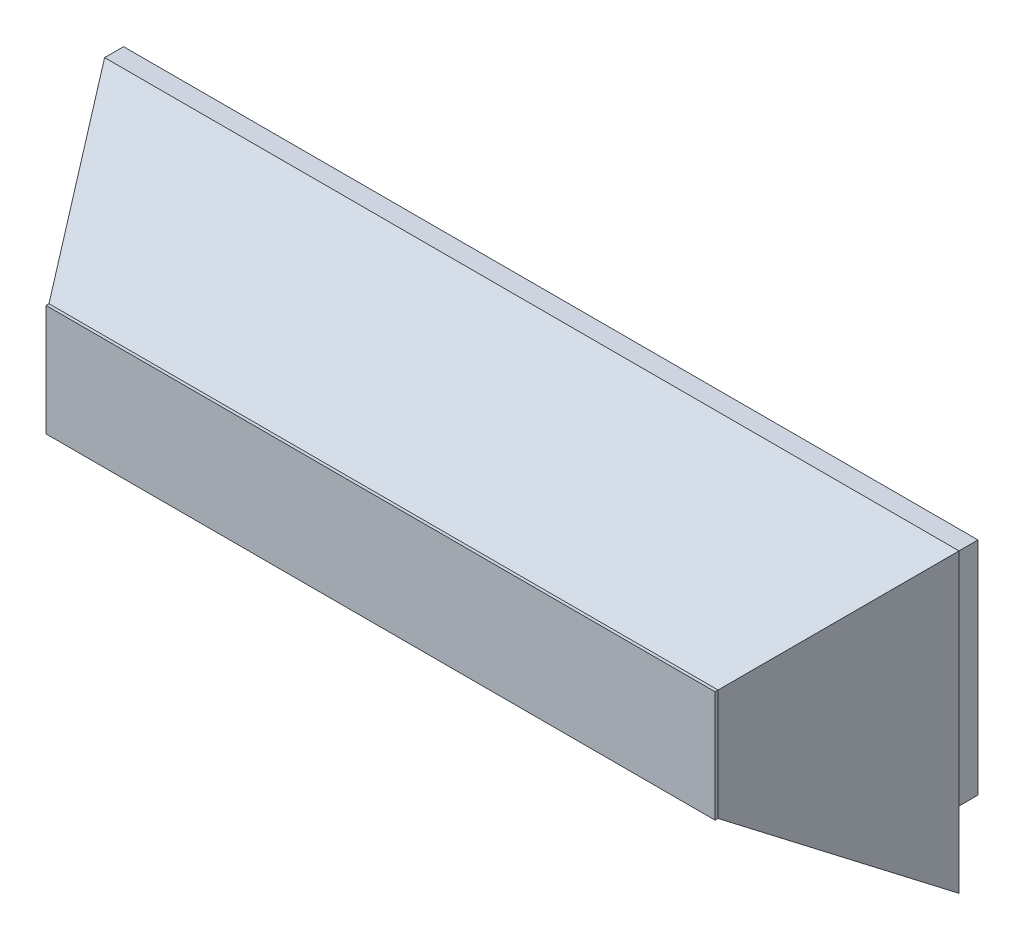
ISO-10303-21;
HEADER;
FILE_DESCRIPTION(('STEP AP214'),'2;1');
FILE_NAME('part.step','',(''),(''),'','','');
FILE_SCHEMA(('AUTOMOTIVE_DESIGN { 1 0 10303 214 1 1 1 1 }'));
ENDSEC;
DATA;
#1=APPLICATION_CONTEXT('core data for automotive mechanical design processes');
#2=APPLICATION_PROTOCOL_DEFINITION('international standard','automotive_design',2000,#1);
#3=PRODUCT_CONTEXT('',#1,'mechanical');
#4=PRODUCT('Part','Part','',(#3));
#5=PRODUCT_RELATED_PRODUCT_CATEGORY('part','',(#4));
#6=PRODUCT_DEFINITION_FORMATION('','',#4);
#7=PRODUCT_DEFINITION_CONTEXT('part definition',#1,'design');
#8=PRODUCT_DEFINITION('design','',#6,#7);
#9=PRODUCT_DEFINITION_SHAPE('','',#8);
#10=(LENGTH_UNIT() NAMED_UNIT(*) SI_UNIT(.MILLI.,.METRE.));
#11=(NAMED_UNIT(*) PLANE_ANGLE_UNIT() SI_UNIT($,.RADIAN.));
#12=(NAMED_UNIT(*) SI_UNIT($,.STERADIAN.) SOLID_ANGLE_UNIT());
#13=UNCERTAINTY_MEASURE_WITH_UNIT(LENGTH_MEASURE(1.E-05),#10,'distance_accuracy_value','');
#14=(GEOMETRIC_REPRESENTATION_CONTEXT(3) GLOBAL_UNCERTAINTY_ASSIGNED_CONTEXT((#13)) GLOBAL_UNIT_ASSIGNED_CONTEXT((#10,
#11,#12)) REPRESENTATION_CONTEXT('',''));
#15=CARTESIAN_POINT('',(0.,0.,0.));
#16=DIRECTION('',(0.,0.,1.));
#17=DIRECTION('',(1.,0.,0.));
#18=AXIS2_PLACEMENT_3D('',#15,#16,#17);
#19=CARTESIAN_POINT('',(135.343835461756,-26.3747756914821,51.));
#20=DIRECTION('',(0.,1.,0.));
#21=DIRECTION('',(0.,0.,1.));
#22=AXIS2_PLACEMENT_3D('',#19,#20,#21);
#23=PLANE('',#22);
#24=DIRECTION('',(1.,0.,0.));
#25=VECTOR('',#24,1.);
#26=CARTESIAN_POINT('',(135.343835461756,-26.3747756914821,50.));
#27=LINE('',#26,#25);
#28=CARTESIAN_POINT('',(-90.2692293473108,-26.3747756914821,50.));
#29=VERTEX_POINT('',#28);
#30=CARTESIAN_POINT('',(135.343835461756,-26.3747756914821,50.));
#31=VERTEX_POINT('',#30);
#32=EDGE_CURVE('E110',#29,#31,#27,.T.);
#33=ORIENTED_EDGE('',*,*,#32,.T.);
#34=DIRECTION('',(0.,0.,-1.));
#35=VECTOR('',#34,1.);
#36=CARTESIAN_POINT('',(135.343835461756,-26.3747756914821,51.));
#37=LINE('',#36,#35);
#38=CARTESIAN_POINT('',(135.343835461756,-26.3747756914821,51.));
#39=VERTEX_POINT('',#38);
#40=EDGE_CURVE('E12',#39,#31,#37,.T.);
#41=ORIENTED_EDGE('',*,*,#40,.F.);
#42=DIRECTION('',(1.,0.,0.));
#43=VECTOR('',#42,1.);
#44=CARTESIAN_POINT('',(135.343835461756,-26.3747756914821,51.));
#45=LINE('',#44,#43);
#46=CARTESIAN_POINT('',(-90.2692293473108,-26.3747756914821,51.));
#47=VERTEX_POINT('',#46);
#48=EDGE_CURVE('E98',#47,#39,#45,.T.);
#49=ORIENTED_EDGE('',*,*,#48,.F.);
#50=DIRECTION('',(0.,0.,-1.));
#51=VECTOR('',#50,1.);
#52=CARTESIAN_POINT('',(-90.2692293473108,-26.3747756914821,51.));
#53=LINE('',#52,#51);
#54=EDGE_CURVE('E106',#47,#29,#53,.T.);
#55=ORIENTED_EDGE('',*,*,#54,.T.);
#56=EDGE_LOOP('',(#33,#41,#49,#55));
#57=FACE_BOUND('',#56,.T.);
#58=ADVANCED_FACE('F47',(#57),#23,.F.);
#59=CARTESIAN_POINT('',(135.343835461756,11.1382891175851,51.));
#60=DIRECTION('',(-1.,0.,0.));
#61=DIRECTION('',(0.,0.,1.));
#62=AXIS2_PLACEMENT_3D('',#59,#60,#61);
#63=PLANE('',#62);
#64=DIRECTION('',(0.,1.,0.));
#65=VECTOR('',#64,1.);
#66=CARTESIAN_POINT('',(135.343835461756,11.1382891175851,50.));
#67=LINE('',#66,#65);
#68=CARTESIAN_POINT('',(135.343835461756,11.1382891175851,50.));
#69=VERTEX_POINT('',#68);
#70=EDGE_CURVE('E102',#31,#69,#67,.T.);
#71=ORIENTED_EDGE('',*,*,#70,.T.);
#72=DIRECTION('',(0.,0.,-1.));
#73=VECTOR('',#72,1.);
#74=CARTESIAN_POINT('',(135.343835461756,11.1382891175851,51.));
#75=LINE('',#74,#73);
#76=CARTESIAN_POINT('',(135.343835461756,11.1382891175851,51.));
#77=VERTEX_POINT('',#76);
#78=EDGE_CURVE('E55',#77,#69,#75,.T.);
#79=ORIENTED_EDGE('',*,*,#78,.F.);
#80=DIRECTION('',(0.,1.,0.));
#81=VECTOR('',#80,1.);
#82=CARTESIAN_POINT('',(135.343835461756,11.1382891175851,51.));
#83=LINE('',#82,#81);
#84=EDGE_CURVE('E93',#39,#77,#83,.T.);
#85=ORIENTED_EDGE('',*,*,#84,.F.);
#86=ORIENTED_EDGE('',*,*,#40,.T.);
#87=EDGE_LOOP('',(#71,#79,#85,#86));
#88=FACE_BOUND('',#87,.T.);
#89=ADVANCED_FACE('F101',(#88),#63,.F.);
#90=CARTESIAN_POINT('',(-90.2692293473108,11.1382891175851,51.));
#91=DIRECTION('',(0.,-1.,0.));
#92=DIRECTION('',(0.,0.,-1.));
#93=AXIS2_PLACEMENT_3D('',#90,#91,#92);
#94=PLANE('',#93);
#95=DIRECTION('',(-1.,0.,0.));
#96=VECTOR('',#95,1.);
#97=CARTESIAN_POINT('',(-90.2692293473108,11.1382891175851,50.));
#98=LINE('',#97,#96);
#99=CARTESIAN_POINT('',(-90.2692293473108,11.1382891175851,50.));
#100=VERTEX_POINT('',#99);
#101=EDGE_CURVE('E80',#69,#100,#98,.T.);
#102=ORIENTED_EDGE('',*,*,#101,.T.);
#103=DIRECTION('',(0.,0.,-1.));
#104=VECTOR('',#103,1.);
#105=CARTESIAN_POINT('',(-90.2692293473108,11.1382891175851,51.));
#106=LINE('',#105,#104);
#107=CARTESIAN_POINT('',(-90.2692293473108,11.1382891175851,51.));
#108=VERTEX_POINT('',#107);
#109=EDGE_CURVE('E103',#108,#100,#106,.T.);
#110=ORIENTED_EDGE('',*,*,#109,.F.);
#111=DIRECTION('',(-1.,0.,0.));
#112=VECTOR('',#111,1.);
#113=CARTESIAN_POINT('',(-90.2692293473108,11.1382891175851,51.));
#114=LINE('',#113,#112);
#115=EDGE_CURVE('E96',#77,#108,#114,.T.);
#116=ORIENTED_EDGE('',*,*,#115,.F.);
#117=ORIENTED_EDGE('',*,*,#78,.T.);
#118=EDGE_LOOP('',(#102,#110,#116,#117));
#119=FACE_BOUND('',#118,.T.);
#120=ADVANCED_FACE('F104',(#119),#94,.F.);
#121=CARTESIAN_POINT('',(-90.2692293473108,-26.3747756914821,51.));
#122=DIRECTION('',(1.,0.,0.));
#123=DIRECTION('',(0.,0.,-1.));
#124=AXIS2_PLACEMENT_3D('',#121,#122,#123);
#125=PLANE('',#124);
#126=DIRECTION('',(0.,-1.,0.));
#127=VECTOR('',#126,1.);
#128=CARTESIAN_POINT('',(-90.2692293473108,-26.3747756914821,50.));
#129=LINE('',#128,#127);
#130=EDGE_CURVE('E86',#100,#29,#129,.T.);
#131=ORIENTED_EDGE('',*,*,#130,.T.);
#132=ORIENTED_EDGE('',*,*,#54,.F.);
#133=DIRECTION('',(0.,-1.,0.));
#134=VECTOR('',#133,1.);
#135=CARTESIAN_POINT('',(-90.2692293473108,-26.3747756914821,51.));
#136=LINE('',#135,#134);
#137=EDGE_CURVE('E63',#108,#47,#136,.T.);
#138=ORIENTED_EDGE('',*,*,#137,.F.);
#139=ORIENTED_EDGE('',*,*,#109,.T.);
#140=EDGE_LOOP('',(#131,#132,#138,#139));
#141=FACE_BOUND('',#140,.T.);
#142=ADVANCED_FACE('F117',(#141),#125,.F.);
#143=CARTESIAN_POINT('',(0.,0.,51.));
#144=DIRECTION('',(0.,0.,-1.));
#145=DIRECTION('',(-1.,0.,0.));
#146=AXIS2_PLACEMENT_3D('',#143,#144,#145);
#147=PLANE('',#146);
#148=ORIENTED_EDGE('',*,*,#48,.T.);
#149=ORIENTED_EDGE('',*,*,#84,.T.);
#150=ORIENTED_EDGE('',*,*,#115,.T.);
#151=ORIENTED_EDGE('',*,*,#137,.T.);
#152=EDGE_LOOP('',(#148,#149,#150,#151));
#153=FACE_BOUND('',#152,.T.);
#154=ADVANCED_FACE('F94',(#153),#147,.F.);
#155=CARTESIAN_POINT('',(0.,0.,50.));
#156=DIRECTION('',(0.,0.,-1.));
#157=DIRECTION('',(-1.,0.,0.));
#158=AXIS2_PLACEMENT_3D('',#155,#156,#157);
#159=PLANE('',#158);
#160=ORIENTED_EDGE('',*,*,#32,.F.);
#161=ORIENTED_EDGE('',*,*,#130,.F.);
#162=ORIENTED_EDGE('',*,*,#101,.F.);
#163=ORIENTED_EDGE('',*,*,#70,.F.);
#164=EDGE_LOOP('',(#160,#161,#162,#163));
#165=FACE_BOUND('',#164,.T.);
#166=ADVANCED_FACE('F120',(#165),#159,.T.);
#167=CLOSED_SHELL('',(#58,#89,#120,#142,#154,#166));
#168=MANIFOLD_SOLID_BREP('B2',#167);
#169=CARTESIAN_POINT('',(0.,0.,0.));
#170=DIRECTION('',(0.,0.,1.));
#171=DIRECTION('',(1.,0.,0.));
#172=AXIS2_PLACEMENT_3D('',#169,#170,#171);
#173=PLANE('',#172);
#174=DIRECTION('',(-1.,0.,0.));
#175=VECTOR('',#174,1.);
#176=CARTESIAN_POINT('',(-121.512696942777,-32.1182432869485,0.));
#177=LINE('',#176,#175);
#178=CARTESIAN_POINT('',(-115.198309749982,-32.1182432869485,0.));
#179=VERTEX_POINT('',#178);
#180=CARTESIAN_POINT('',(-121.512696942777,-32.1182432869485,0.));
#181=VERTEX_POINT('',#180);
#182=EDGE_CURVE('E45',#179,#181,#177,.T.);
#183=ORIENTED_EDGE('',*,*,#182,.F.);
#184=DIRECTION('',(0.,-1.,0.));
#185=VECTOR('',#184,1.);
#186=CARTESIAN_POINT('',(-115.198309749982,-26.3747756914821,0.));
#187=LINE('',#186,#185);
#188=CARTESIAN_POINT('',(-115.198309749982,-51.3038560941538,0.));
#189=VERTEX_POINT('',#188);
#190=EDGE_CURVE('E356',#179,#189,#187,.T.);
#191=ORIENTED_EDGE('',*,*,#190,.T.);
#192=DIRECTION('',(1.,0.,0.));
#193=VECTOR('',#192,1.);
#194=CARTESIAN_POINT('',(135.343835461756,-51.3038560941538,0.));
#195=LINE('',#194,#193);
#196=CARTESIAN_POINT('',(160.272915864428,-51.3038560941538,0.));
#197=VERTEX_POINT('',#196);
#198=EDGE_CURVE('E292',#189,#197,#195,.T.);
#199=ORIENTED_EDGE('',*,*,#198,.T.);
#200=DIRECTION('',(0.,1.,0.));
#201=VECTOR('',#200,1.);
#202=CARTESIAN_POINT('',(160.272915864428,11.1382891175851,0.));
#203=LINE('',#202,#201);
#204=CARTESIAN_POINT('',(160.272915864428,-32.1182432869485,0.));
#205=VERTEX_POINT('',#204);
#206=EDGE_CURVE('E360',#197,#205,#203,.T.);
#207=ORIENTED_EDGE('',*,*,#206,.T.);
#208=DIRECTION('',(-1.,0.,0.));
#209=VECTOR('',#208,1.);
#210=CARTESIAN_POINT('',(166.587303057223,-32.1182432869485,0.));
#211=LINE('',#210,#209);
#212=CARTESIAN_POINT('',(166.587303057223,-32.1182432869485,0.));
#213=VERTEX_POINT('',#212);
#214=EDGE_CURVE('E196',#213,#205,#211,.T.);
#215=ORIENTED_EDGE('',*,*,#214,.F.);
#216=DIRECTION('',(0.,1.,0.));
#217=VECTOR('',#216,1.);
#218=CARTESIAN_POINT('',(166.587303057223,42.3817567130515,0.));
#219=LINE('',#218,#217);
#220=CARTESIAN_POINT('',(166.587303057223,-57.6182432869485,0.));
#221=VERTEX_POINT('',#220);
#222=EDGE_CURVE('E342',#221,#213,#219,.T.);
#223=ORIENTED_EDGE('',*,*,#222,.F.);
#224=DIRECTION('',(1.,0.,0.));
#225=VECTOR('',#224,1.);
#226=CARTESIAN_POINT('',(-121.512696942777,-57.6182432869485,0.));
#227=LINE('',#226,#225);
#228=CARTESIAN_POINT('',(-121.512696942777,-57.6182432869485,0.));
#229=VERTEX_POINT('',#228);
#230=EDGE_CURVE('E367',#229,#221,#227,.T.);
#231=ORIENTED_EDGE('',*,*,#230,.F.);
#232=DIRECTION('',(0.,-1.,0.));
#233=VECTOR('',#232,1.);
#234=CARTESIAN_POINT('',(-121.512696942777,42.3817567130515,0.));
#235=LINE('',#234,#233);
#236=EDGE_CURVE('E189',#181,#229,#235,.T.);
#237=ORIENTED_EDGE('',*,*,#236,.F.);
#238=EDGE_LOOP('',(#183,#191,#199,#207,#215,#223,#231,#237));
#239=FACE_BOUND('',#238,.T.);
#240=ADVANCED_FACE('F171',(#239),#173,.F.);
#241=CARTESIAN_POINT('',(166.587303057223,42.3817567130515,0.));
#242=DIRECTION('',(0.848048096156426,0.,0.529919264233205));
#243=DIRECTION('',(0.529919264233205,0.,-0.848048096156426));
#244=AXIS2_PLACEMENT_3D('',#241,#242,#243);
#245=PLANE('',#244);
#246=ORIENTED_EDGE('',*,*,#222,.T.);
#247=DIRECTION('',(0.,-1.,0.));
#248=VECTOR('',#247,1.);
#249=CARTESIAN_POINT('',(166.587303057223,-7.61824328694852,0.));
#250=LINE('',#249,#248);
#251=CARTESIAN_POINT('',(166.587303057223,42.3817567130515,0.));
#252=VERTEX_POINT('',#251);
#253=EDGE_CURVE('E290',#252,#213,#250,.T.);
#254=ORIENTED_EDGE('',*,*,#253,.F.);
#255=DIRECTION('',(0.468237942151902,0.468237942151902,-0.749337346632813));
#256=VECTOR('',#255,1.);
#257=CARTESIAN_POINT('',(103.422308484629,-20.7832378595421,101.085121841212));
#258=LINE('',#257,#256);
#259=CARTESIAN_POINT('',(135.343835461756,11.1382891175851,50.));
#260=VERTEX_POINT('',#259);
#261=EDGE_CURVE('E180',#260,#252,#258,.T.);
#262=ORIENTED_EDGE('',*,*,#261,.F.);
#263=DIRECTION('',(0.,-1.,0.));
#264=VECTOR('',#263,1.);
#265=CARTESIAN_POINT('',(135.343835461756,42.3817567130515,50.));
#266=LINE('',#265,#264);
#267=CARTESIAN_POINT('',(135.343835461756,-26.3747756914821,50.));
#268=VERTEX_POINT('',#267);
#269=EDGE_CURVE('E369',#268,#260,#266,.F.);
#270=ORIENTED_EDGE('',*,*,#269,.F.);
#271=DIRECTION('',(0.468237942151902,-0.468237942151902,-0.749337346632813));
#272=VECTOR('',#271,1.);
#273=CARTESIAN_POINT('',(144.662626010158,-35.6935662398838,35.0868177164915));
#274=LINE('',#273,#272);
#275=EDGE_CURVE('E373',#268,#221,#274,.T.);
#276=ORIENTED_EDGE('',*,*,#275,.T.);
#277=EDGE_LOOP('',(#246,#254,#262,#270,#276));
#278=FACE_BOUND('',#277,.T.);
#279=ADVANCED_FACE('F407',(#278),#245,.T.);
#280=CARTESIAN_POINT('',(-121.512696942777,42.3817567130515,0.));
#281=DIRECTION('',(0.,0.848048096156426,0.529919264233205));
#282=DIRECTION('',(0.,-0.529919264233205,0.848048096156426));
#283=AXIS2_PLACEMENT_3D('',#280,#281,#282);
#284=PLANE('',#283);
#285=DIRECTION('',(-1.,0.,0.));
#286=VECTOR('',#285,1.);
#287=CARTESIAN_POINT('',(-121.512696942777,42.3817567130515,0.));
#288=LINE('',#287,#286);
#289=CARTESIAN_POINT('',(-121.512696942777,42.3817567130515,0.));
#290=VERTEX_POINT('',#289);
#291=EDGE_CURVE('E363',#252,#290,#288,.T.);
#292=ORIENTED_EDGE('',*,*,#291,.T.);
#293=DIRECTION('',(-0.468237942151902,0.468237942151902,-0.749337346632813));
#294=VECTOR('',#293,1.);
#295=CARTESIAN_POINT('',(-121.512696942777,42.3817567130515,0.));
#296=LINE('',#295,#294);
#297=CARTESIAN_POINT('',(-90.2692293473108,11.1382891175851,50.));
#298=VERTEX_POINT('',#297);
#299=EDGE_CURVE('E372',#298,#290,#296,.T.);
#300=ORIENTED_EDGE('',*,*,#299,.F.);
#301=DIRECTION('',(1.,0.,0.));
#302=VECTOR('',#301,1.);
#303=CARTESIAN_POINT('',(-121.512696942777,11.1382891175851,50.));
#304=LINE('',#303,#302);
#305=EDGE_CURVE('E383',#260,#298,#304,.F.);
#306=ORIENTED_EDGE('',*,*,#305,.F.);
#307=ORIENTED_EDGE('',*,*,#261,.T.);
#308=EDGE_LOOP('',(#292,#300,#306,#307));
#309=FACE_BOUND('',#308,.T.);
#310=ADVANCED_FACE('F173',(#309),#284,.T.);
#311=CARTESIAN_POINT('',(-121.512696942777,42.3817567130515,0.));
#312=DIRECTION('',(-0.848048096156426,0.,0.529919264233205));
#313=DIRECTION('',(0.529919264233205,0.,0.848048096156426));
#314=AXIS2_PLACEMENT_3D('',#311,#312,#313);
#315=PLANE('',#314);
#316=EDGE_CURVE('E365',#290,#181,#235,.T.);
#317=ORIENTED_EDGE('',*,*,#316,.T.);
#318=ORIENTED_EDGE('',*,*,#236,.T.);
#319=DIRECTION('',(-0.468237942151902,-0.468237942151902,-0.749337346632813));
#320=VECTOR('',#319,1.);
#321=CARTESIAN_POINT('',(-121.512696942777,-57.6182432869485,0.));
#322=LINE('',#321,#320);
#323=CARTESIAN_POINT('',(-90.2692293473108,-26.3747756914821,50.));
#324=VERTEX_POINT('',#323);
#325=EDGE_CURVE('E376',#324,#229,#322,.T.);
#326=ORIENTED_EDGE('',*,*,#325,.F.);
#327=DIRECTION('',(0.,1.,0.));
#328=VECTOR('',#327,1.);
#329=CARTESIAN_POINT('',(-90.2692293473108,42.3817567130515,50.));
#330=LINE('',#329,#328);
#331=EDGE_CURVE('E385',#298,#324,#330,.F.);
#332=ORIENTED_EDGE('',*,*,#331,.F.);
#333=ORIENTED_EDGE('',*,*,#299,.T.);
#334=EDGE_LOOP('',(#317,#318,#326,#332,#333));
#335=FACE_BOUND('',#334,.T.);
#336=ADVANCED_FACE('F420',(#335),#315,.T.);
#337=CARTESIAN_POINT('',(-121.512696942777,-57.6182432869485,0.));
#338=DIRECTION('',(0.,-0.848048096156426,0.529919264233205));
#339=DIRECTION('',(0.,-0.529919264233205,-0.848048096156426));
#340=AXIS2_PLACEMENT_3D('',#337,#338,#339);
#341=PLANE('',#340);
#342=ORIENTED_EDGE('',*,*,#230,.T.);
#343=ORIENTED_EDGE('',*,*,#275,.F.);
#344=DIRECTION('',(-1.,0.,0.));
#345=VECTOR('',#344,1.);
#346=CARTESIAN_POINT('',(-121.512696942777,-26.3747756914821,50.));
#347=LINE('',#346,#345);
#348=EDGE_CURVE('E175',#324,#268,#347,.F.);
#349=ORIENTED_EDGE('',*,*,#348,.F.);
#350=ORIENTED_EDGE('',*,*,#325,.T.);
#351=EDGE_LOOP('',(#342,#343,#349,#350));
#352=FACE_BOUND('',#351,.T.);
#353=ADVANCED_FACE('F404',(#352),#341,.T.);
#354=CARTESIAN_POINT('',(135.343835461756,-26.3747756914821,50.));
#355=DIRECTION('',(0.,-0.894934361602025,0.44619781310981));
#356=DIRECTION('',(0.,-0.44619781310981,-0.894934361602025));
#357=AXIS2_PLACEMENT_3D('',#354,#355,#356);
#358=PLANE('',#357);
#359=ORIENTED_EDGE('',*,*,#348,.T.);
#360=DIRECTION('',(-0.407475119886485,0.407475119886485,0.817268654327932));
#361=VECTOR('',#360,1.);
#362=CARTESIAN_POINT('',(135.343835461756,-26.3747756914821,50.));
#363=LINE('',#362,#361);
#364=EDGE_CURVE('E344',#197,#268,#363,.T.);
#365=ORIENTED_EDGE('',*,*,#364,.F.);
#366=ORIENTED_EDGE('',*,*,#198,.F.);
#367=DIRECTION('',(0.407475119886485,0.407475119886485,0.817268654327932));
#368=VECTOR('',#367,1.);
#369=CARTESIAN_POINT('',(-90.2692293473108,-26.3747756914821,50.));
#370=LINE('',#369,#368);
#371=EDGE_CURVE('E340',#189,#324,#370,.T.);
#372=ORIENTED_EDGE('',*,*,#371,.T.);
#373=EDGE_LOOP('',(#359,#365,#366,#372));
#374=FACE_BOUND('',#373,.T.);
#375=ADVANCED_FACE('F393',(#374),#358,.F.);
#376=CARTESIAN_POINT('',(-90.2692293473108,-26.3747756914821,50.));
#377=DIRECTION('',(-0.894934361602025,0.,0.44619781310981));
#378=DIRECTION('',(0.44619781310981,0.,0.894934361602025));
#379=AXIS2_PLACEMENT_3D('',#376,#377,#378);
#380=PLANE('',#379);
#381=ORIENTED_EDGE('',*,*,#331,.T.);
#382=ORIENTED_EDGE('',*,*,#371,.F.);
#383=ORIENTED_EDGE('',*,*,#190,.F.);
#384=CARTESIAN_POINT('',(-115.198309749982,36.0673695202567,0.));
#385=VERTEX_POINT('',#384);
#386=EDGE_CURVE('E348',#385,#179,#187,.T.);
#387=ORIENTED_EDGE('',*,*,#386,.F.);
#388=DIRECTION('',(0.407475119886485,-0.407475119886485,0.817268654327932));
#389=VECTOR('',#388,1.);
#390=CARTESIAN_POINT('',(-90.2692293473108,11.1382891175851,50.));
#391=LINE('',#390,#389);
#392=EDGE_CURVE('E343',#385,#298,#391,.T.);
#393=ORIENTED_EDGE('',*,*,#392,.T.);
#394=EDGE_LOOP('',(#381,#382,#383,#387,#393));
#395=FACE_BOUND('',#394,.T.);
#396=ADVANCED_FACE('F427',(#395),#380,.F.);
#397=CARTESIAN_POINT('',(-90.2692293473108,11.1382891175851,50.));
#398=DIRECTION('',(0.,0.894934361602025,0.44619781310981));
#399=DIRECTION('',(0.,-0.44619781310981,0.894934361602025));
#400=AXIS2_PLACEMENT_3D('',#397,#398,#399);
#401=PLANE('',#400);
#402=ORIENTED_EDGE('',*,*,#305,.T.);
#403=ORIENTED_EDGE('',*,*,#392,.F.);
#404=DIRECTION('',(-1.,0.,0.));
#405=VECTOR('',#404,1.);
#406=CARTESIAN_POINT('',(-90.2692293473108,36.0673695202567,0.));
#407=LINE('',#406,#405);
#408=CARTESIAN_POINT('',(160.272915864428,36.0673695202567,0.));
#409=VERTEX_POINT('',#408);
#410=EDGE_CURVE('E357',#409,#385,#407,.T.);
#411=ORIENTED_EDGE('',*,*,#410,.F.);
#412=DIRECTION('',(-0.407475119886485,-0.407475119886485,0.817268654327932));
#413=VECTOR('',#412,1.);
#414=CARTESIAN_POINT('',(135.343835461756,11.1382891175851,50.));
#415=LINE('',#414,#413);
#416=EDGE_CURVE('E347',#409,#260,#415,.T.);
#417=ORIENTED_EDGE('',*,*,#416,.T.);
#418=EDGE_LOOP('',(#402,#403,#411,#417));
#419=FACE_BOUND('',#418,.T.);
#420=ADVANCED_FACE('F434',(#419),#401,.F.);
#421=CARTESIAN_POINT('',(135.343835461756,11.1382891175851,50.));
#422=DIRECTION('',(0.894934361602025,0.,0.44619781310981));
#423=DIRECTION('',(0.44619781310981,0.,-0.894934361602025));
#424=AXIS2_PLACEMENT_3D('',#421,#422,#423);
#425=PLANE('',#424);
#426=ORIENTED_EDGE('',*,*,#269,.T.);
#427=ORIENTED_EDGE('',*,*,#416,.F.);
#428=EDGE_CURVE('E353',#205,#409,#203,.T.);
#429=ORIENTED_EDGE('',*,*,#428,.F.);
#430=ORIENTED_EDGE('',*,*,#206,.F.);
#431=ORIENTED_EDGE('',*,*,#364,.T.);
#432=EDGE_LOOP('',(#426,#427,#429,#430,#431));
#433=FACE_BOUND('',#432,.T.);
#434=ADVANCED_FACE('F399',(#433),#425,.F.);
#435=CARTESIAN_POINT('',(166.587303057223,-7.61824328694852,-6.4));
#436=DIRECTION('',(-1.,0.,0.));
#437=DIRECTION('',(0.,0.,1.));
#438=AXIS2_PLACEMENT_3D('',#435,#436,#437);
#439=PLANE('',#438);
#440=ORIENTED_EDGE('',*,*,#253,.T.);
#441=DIRECTION('',(0.,0.,1.));
#442=VECTOR('',#441,1.);
#443=CARTESIAN_POINT('',(166.587303057223,-32.1182432869485,-6.4));
#444=LINE('',#443,#442);
#445=CARTESIAN_POINT('',(166.587303057223,-32.1182432869485,-6.4));
#446=VERTEX_POINT('',#445);
#447=EDGE_CURVE('E288',#446,#213,#444,.T.);
#448=ORIENTED_EDGE('',*,*,#447,.F.);
#449=DIRECTION('',(0.,-1.,0.));
#450=VECTOR('',#449,1.);
#451=CARTESIAN_POINT('',(166.587303057223,32.4650964245429,-6.4));
#452=LINE('',#451,#450);
#453=CARTESIAN_POINT('',(166.587303057223,42.3817567130515,-6.4));
#454=VERTEX_POINT('',#453);
#455=EDGE_CURVE('E274',#454,#446,#452,.T.);
#456=ORIENTED_EDGE('',*,*,#455,.F.);
#457=DIRECTION('',(0.,0.,1.));
#458=VECTOR('',#457,1.);
#459=CARTESIAN_POINT('',(166.587303057223,42.3817567130515,-6.4));
#460=LINE('',#459,#458);
#461=EDGE_CURVE('E311',#454,#252,#460,.T.);
#462=ORIENTED_EDGE('',*,*,#461,.T.);
#463=EDGE_LOOP('',(#440,#448,#456,#462));
#464=FACE_BOUND('',#463,.T.);
#465=ADVANCED_FACE('F289',(#464),#439,.F.);
#466=CARTESIAN_POINT('',(166.587303057223,-32.1182432869485,-6.4));
#467=DIRECTION('',(0.,1.,0.));
#468=DIRECTION('',(0.,0.,1.));
#469=AXIS2_PLACEMENT_3D('',#466,#467,#468);
#470=PLANE('',#469);
#471=ORIENTED_EDGE('',*,*,#214,.T.);
#472=CARTESIAN_POINT('',(160.187303057223,-32.1182432869485,0.));
#473=VERTEX_POINT('',#472);
#474=EDGE_CURVE('E313',#205,#473,#211,.T.);
#475=ORIENTED_EDGE('',*,*,#474,.T.);
#476=DIRECTION('',(0.,0.,1.));
#477=VECTOR('',#476,1.);
#478=CARTESIAN_POINT('',(160.187303057223,-32.1182432869485,-6.4));
#479=LINE('',#478,#477);
#480=CARTESIAN_POINT('',(160.187303057223,-32.1182432869485,-6.4));
#481=VERTEX_POINT('',#480);
#482=EDGE_CURVE('E293',#481,#473,#479,.T.);
#483=ORIENTED_EDGE('',*,*,#482,.F.);
#484=DIRECTION('',(-1.,0.,0.));
#485=VECTOR('',#484,1.);
#486=CARTESIAN_POINT('',(166.587303057223,-32.1182432869485,-6.4));
#487=LINE('',#486,#485);
#488=EDGE_CURVE('E278',#446,#481,#487,.T.);
#489=ORIENTED_EDGE('',*,*,#488,.F.);
#490=ORIENTED_EDGE('',*,*,#447,.T.);
#491=EDGE_LOOP('',(#471,#475,#483,#489,#490));
#492=FACE_BOUND('',#491,.T.);
#493=ADVANCED_FACE('F295',(#492),#470,.F.);
#494=CARTESIAN_POINT('',(160.187303057223,-7.61824328694852,-6.4));
#495=DIRECTION('',(1.,0.,0.));
#496=DIRECTION('',(0.,0.,-1.));
#497=AXIS2_PLACEMENT_3D('',#494,#495,#496);
#498=PLANE('',#497);
#499=DIRECTION('',(0.,1.,0.));
#500=VECTOR('',#499,1.);
#501=CARTESIAN_POINT('',(160.187303057223,-7.61824328694852,0.));
#502=LINE('',#501,#500);
#503=CARTESIAN_POINT('',(160.187303057223,32.4650964245428,0.));
#504=VERTEX_POINT('',#503);
#505=EDGE_CURVE('E315',#473,#504,#502,.T.);
#506=ORIENTED_EDGE('',*,*,#505,.T.);
#507=DIRECTION('',(0.,0.,1.));
#508=VECTOR('',#507,1.);
#509=CARTESIAN_POINT('',(160.187303057223,32.4650964245428,-6.4));
#510=LINE('',#509,#508);
#511=CARTESIAN_POINT('',(160.187303057223,32.4650964245428,-6.4));
#512=VERTEX_POINT('',#511);
#513=EDGE_CURVE('E336',#512,#504,#510,.T.);
#514=ORIENTED_EDGE('',*,*,#513,.F.);
#515=DIRECTION('',(0.,1.,0.));
#516=VECTOR('',#515,1.);
#517=CARTESIAN_POINT('',(160.187303057223,-32.1182432869485,-6.4));
#518=LINE('',#517,#516);
#519=EDGE_CURVE('E298',#481,#512,#518,.T.);
#520=ORIENTED_EDGE('',*,*,#519,.F.);
#521=ORIENTED_EDGE('',*,*,#482,.T.);
#522=EDGE_LOOP('',(#506,#514,#520,#521));
#523=FACE_BOUND('',#522,.T.);
#524=ADVANCED_FACE('F438',(#523),#498,.F.);
#525=CARTESIAN_POINT('',(-115.112696942777,32.4650964245429,-6.4));
#526=DIRECTION('',(0.,1.,0.));
#527=DIRECTION('',(0.,0.,1.));
#528=AXIS2_PLACEMENT_3D('',#525,#526,#527);
#529=PLANE('',#528);
#530=DIRECTION('',(-1.,0.,0.));
#531=VECTOR('',#530,1.);
#532=CARTESIAN_POINT('',(-115.112696942777,32.4650964245429,0.));
#533=LINE('',#532,#531);
#534=CARTESIAN_POINT('',(-115.112696942777,32.4650964245429,0.));
#535=VERTEX_POINT('',#534);
#536=EDGE_CURVE('E318',#504,#535,#533,.T.);
#537=ORIENTED_EDGE('',*,*,#536,.T.);
#538=DIRECTION('',(0.,0.,1.));
#539=VECTOR('',#538,1.);
#540=CARTESIAN_POINT('',(-115.112696942777,32.4650964245429,-6.4));
#541=LINE('',#540,#539);
#542=CARTESIAN_POINT('',(-115.112696942777,32.4650964245429,-6.4));
#543=VERTEX_POINT('',#542);
#544=EDGE_CURVE('E333',#543,#535,#541,.T.);
#545=ORIENTED_EDGE('',*,*,#544,.F.);
#546=DIRECTION('',(-1.,0.,0.));
#547=VECTOR('',#546,1.);
#548=CARTESIAN_POINT('',(-111.596036654269,32.4650964245429,-6.4));
#549=LINE('',#548,#547);
#550=EDGE_CURVE('E300',#512,#543,#549,.T.);
#551=ORIENTED_EDGE('',*,*,#550,.F.);
#552=ORIENTED_EDGE('',*,*,#513,.T.);
#553=EDGE_LOOP('',(#537,#545,#551,#552));
#554=FACE_BOUND('',#553,.T.);
#555=ADVANCED_FACE('F444',(#554),#529,.F.);
#556=CARTESIAN_POINT('',(-115.112696942777,-32.1182432869485,-6.4));
#557=DIRECTION('',(-1.,0.,0.));
#558=DIRECTION('',(0.,0.,1.));
#559=AXIS2_PLACEMENT_3D('',#556,#557,#558);
#560=PLANE('',#559);
#561=DIRECTION('',(0.,-1.,0.));
#562=VECTOR('',#561,1.);
#563=CARTESIAN_POINT('',(-115.112696942777,-32.1182432869485,0.));
#564=LINE('',#563,#562);
#565=CARTESIAN_POINT('',(-115.112696942777,-32.1182432869485,0.));
#566=VERTEX_POINT('',#565);
#567=EDGE_CURVE('E320',#535,#566,#564,.T.);
#568=ORIENTED_EDGE('',*,*,#567,.T.);
#569=DIRECTION('',(0.,0.,1.));
#570=VECTOR('',#569,1.);
#571=CARTESIAN_POINT('',(-115.112696942777,-32.1182432869485,-6.4));
#572=LINE('',#571,#570);
#573=CARTESIAN_POINT('',(-115.112696942777,-32.1182432869485,-6.4));
#574=VERTEX_POINT('',#573);
#575=EDGE_CURVE('E330',#574,#566,#572,.T.);
#576=ORIENTED_EDGE('',*,*,#575,.F.);
#577=DIRECTION('',(0.,-1.,0.));
#578=VECTOR('',#577,1.);
#579=CARTESIAN_POINT('',(-115.112696942777,-32.1182432869485,-6.4));
#580=LINE('',#579,#578);
#581=EDGE_CURVE('E304',#543,#574,#580,.T.);
#582=ORIENTED_EDGE('',*,*,#581,.F.);
#583=ORIENTED_EDGE('',*,*,#544,.T.);
#584=EDGE_LOOP('',(#568,#576,#582,#583));
#585=FACE_BOUND('',#584,.T.);
#586=ADVANCED_FACE('F446',(#585),#560,.F.);
#587=CARTESIAN_POINT('',(-121.512696942777,-32.1182432869485,-6.4));
#588=DIRECTION('',(0.,1.,0.));
#589=DIRECTION('',(0.,0.,1.));
#590=AXIS2_PLACEMENT_3D('',#587,#588,#589);
#591=PLANE('',#590);
#592=EDGE_CURVE('E182',#566,#179,#177,.T.);
#593=ORIENTED_EDGE('',*,*,#592,.T.);
#594=ORIENTED_EDGE('',*,*,#182,.T.);
#595=DIRECTION('',(0.,0.,1.));
#596=VECTOR('',#595,1.);
#597=CARTESIAN_POINT('',(-121.512696942777,-32.1182432869485,-6.4));
#598=LINE('',#597,#596);
#599=CARTESIAN_POINT('',(-121.512696942777,-32.1182432869485,-6.4));
#600=VERTEX_POINT('',#599);
#601=EDGE_CURVE('E327',#600,#181,#598,.T.);
#602=ORIENTED_EDGE('',*,*,#601,.F.);
#603=DIRECTION('',(-1.,0.,0.));
#604=VECTOR('',#603,1.);
#605=CARTESIAN_POINT('',(-121.512696942777,-32.1182432869485,-6.4));
#606=LINE('',#605,#604);
#607=EDGE_CURVE('E306',#574,#600,#606,.T.);
#608=ORIENTED_EDGE('',*,*,#607,.F.);
#609=ORIENTED_EDGE('',*,*,#575,.T.);
#610=EDGE_LOOP('',(#593,#594,#602,#608,#609));
#611=FACE_BOUND('',#610,.T.);
#612=ADVANCED_FACE('F422',(#611),#591,.F.);
#613=CARTESIAN_POINT('',(-121.512696942777,42.3817567130515,-6.4));
#614=DIRECTION('',(1.,0.,0.));
#615=DIRECTION('',(0.,0.,-1.));
#616=AXIS2_PLACEMENT_3D('',#613,#614,#615);
#617=PLANE('',#616);
#618=ORIENTED_EDGE('',*,*,#316,.F.);
#619=DIRECTION('',(0.,0.,1.));
#620=VECTOR('',#619,1.);
#621=CARTESIAN_POINT('',(-121.512696942777,42.3817567130515,-6.4));
#622=LINE('',#621,#620);
#623=CARTESIAN_POINT('',(-121.512696942777,42.3817567130515,-6.4));
#624=VERTEX_POINT('',#623);
#625=EDGE_CURVE('E324',#624,#290,#622,.T.);
#626=ORIENTED_EDGE('',*,*,#625,.F.);
#627=DIRECTION('',(0.,1.,0.));
#628=VECTOR('',#627,1.);
#629=CARTESIAN_POINT('',(-121.512696942777,42.3817567130515,-6.4));
#630=LINE('',#629,#628);
#631=EDGE_CURVE('E308',#600,#624,#630,.T.);
#632=ORIENTED_EDGE('',*,*,#631,.F.);
#633=ORIENTED_EDGE('',*,*,#601,.T.);
#634=EDGE_LOOP('',(#618,#626,#632,#633));
#635=FACE_BOUND('',#634,.T.);
#636=ADVANCED_FACE('F417',(#635),#617,.F.);
#637=CARTESIAN_POINT('',(166.587303057223,42.3817567130515,-6.4));
#638=DIRECTION('',(0.,-1.,0.));
#639=DIRECTION('',(0.,0.,-1.));
#640=AXIS2_PLACEMENT_3D('',#637,#638,#639);
#641=PLANE('',#640);
#642=ORIENTED_EDGE('',*,*,#291,.F.);
#643=ORIENTED_EDGE('',*,*,#461,.F.);
#644=DIRECTION('',(1.,0.,0.));
#645=VECTOR('',#644,1.);
#646=CARTESIAN_POINT('',(-117.996036654269,42.3817567130515,-6.4));
#647=LINE('',#646,#645);
#648=EDGE_CURVE('E281',#624,#454,#647,.T.);
#649=ORIENTED_EDGE('',*,*,#648,.F.);
#650=ORIENTED_EDGE('',*,*,#625,.T.);
#651=EDGE_LOOP('',(#642,#643,#649,#650));
#652=FACE_BOUND('',#651,.T.);
#653=ADVANCED_FACE('F412',(#652),#641,.F.);
#654=CARTESIAN_POINT('',(0.,0.,-6.4));
#655=DIRECTION('',(0.,0.,1.));
#656=DIRECTION('',(1.,0.,0.));
#657=AXIS2_PLACEMENT_3D('',#654,#655,#656);
#658=PLANE('',#657);
#659=ORIENTED_EDGE('',*,*,#455,.T.);
#660=ORIENTED_EDGE('',*,*,#488,.T.);
#661=ORIENTED_EDGE('',*,*,#519,.T.);
#662=ORIENTED_EDGE('',*,*,#550,.T.);
#663=ORIENTED_EDGE('',*,*,#581,.T.);
#664=ORIENTED_EDGE('',*,*,#607,.T.);
#665=ORIENTED_EDGE('',*,*,#631,.T.);
#666=ORIENTED_EDGE('',*,*,#648,.T.);
#667=EDGE_LOOP('',(#659,#660,#661,#662,#663,#664,#665,#666));
#668=FACE_BOUND('',#667,.T.);
#669=ADVANCED_FACE('F276',(#668),#658,.F.);
#670=CARTESIAN_POINT('',(0.,0.,0.));
#671=DIRECTION('',(0.,0.,1.));
#672=DIRECTION('',(1.,0.,0.));
#673=AXIS2_PLACEMENT_3D('',#670,#671,#672);
#674=PLANE('',#673);
#675=ORIENTED_EDGE('',*,*,#410,.T.);
#676=ORIENTED_EDGE('',*,*,#386,.T.);
#677=ORIENTED_EDGE('',*,*,#592,.F.);
#678=ORIENTED_EDGE('',*,*,#567,.F.);
#679=ORIENTED_EDGE('',*,*,#536,.F.);
#680=ORIENTED_EDGE('',*,*,#505,.F.);
#681=ORIENTED_EDGE('',*,*,#474,.F.);
#682=ORIENTED_EDGE('',*,*,#428,.T.);
#683=EDGE_LOOP('',(#675,#676,#677,#678,#679,#680,#681,#682));
#684=FACE_BOUND('',#683,.T.);
#685=ADVANCED_FACE('F429',(#684),#674,.T.);
#686=CLOSED_SHELL('',(#240,#279,#310,#336,#353,#375,#396,#420,#434,#465,#493,#524,#555,#586,
#612,#636,#653,#669,#685));
#687=MANIFOLD_SOLID_BREP('B6',#686);
#688=ADVANCED_BREP_SHAPE_REPRESENTATION('',(#18,#168,#687),#14);
#689=SHAPE_DEFINITION_REPRESENTATION(#9,#688);
ENDSEC;
END-ISO-10303-21;
